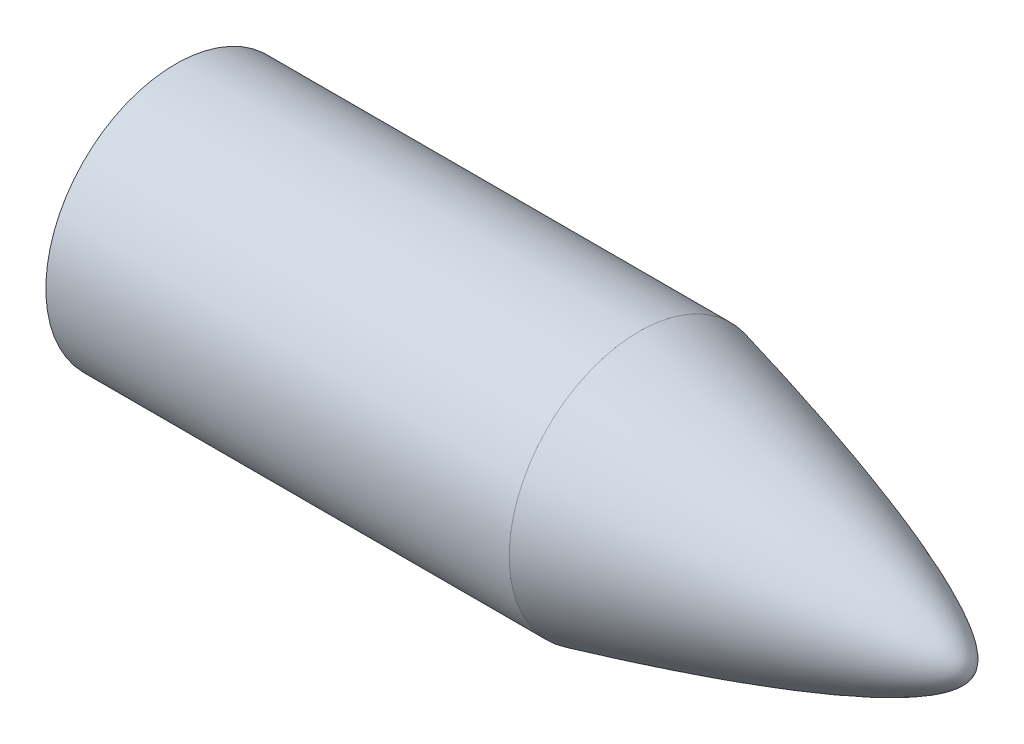
ISO-10303-21;
HEADER;
FILE_DESCRIPTION(('STEP AP214'),'2;1');
FILE_NAME('part.step','',(''),(''),'','','');
FILE_SCHEMA(('AUTOMOTIVE_DESIGN { 1 0 10303 214 1 1 1 1 }'));
ENDSEC;
DATA;
#1=APPLICATION_CONTEXT('core data for automotive mechanical design processes');
#2=APPLICATION_PROTOCOL_DEFINITION('international standard','automotive_design',2000,#1);
#3=PRODUCT_CONTEXT('',#1,'mechanical');
#4=PRODUCT('Part','Part','',(#3));
#5=PRODUCT_RELATED_PRODUCT_CATEGORY('part','',(#4));
#6=PRODUCT_DEFINITION_FORMATION('','',#4);
#7=PRODUCT_DEFINITION_CONTEXT('part definition',#1,'design');
#8=PRODUCT_DEFINITION('design','',#6,#7);
#9=PRODUCT_DEFINITION_SHAPE('','',#8);
#10=(LENGTH_UNIT() NAMED_UNIT(*) SI_UNIT(.MILLI.,.METRE.));
#11=(NAMED_UNIT(*) PLANE_ANGLE_UNIT() SI_UNIT($,.RADIAN.));
#12=(NAMED_UNIT(*) SI_UNIT($,.STERADIAN.) SOLID_ANGLE_UNIT());
#13=UNCERTAINTY_MEASURE_WITH_UNIT(LENGTH_MEASURE(1.E-05),#10,'distance_accuracy_value','');
#14=(GEOMETRIC_REPRESENTATION_CONTEXT(3) GLOBAL_UNCERTAINTY_ASSIGNED_CONTEXT((#13)) GLOBAL_UNIT_ASSIGNED_CONTEXT((#10,
#11,#12)) REPRESENTATION_CONTEXT('',''));
#15=CARTESIAN_POINT('',(0.,0.,0.));
#16=DIRECTION('',(0.,0.,1.));
#17=DIRECTION('',(1.,0.,0.));
#18=AXIS2_PLACEMENT_3D('',#15,#16,#17);
#19=CARTESIAN_POINT('',(-85.0440677966101,0.,-49.));
#20=DIRECTION('',(0.,-1.,0.));
#21=DIRECTION('',(0.986922201965997,0.,0.16119729298778));
#22=AXIS2_PLACEMENT_3D('',#19,#20,#21);
#23=ELLIPSE('',#22,303.9753279462,34.2803212372326);
#24=TRIMMED_CURVE('',#23,(PARAMETER_VALUE(1.20857444075924)),
(PARAMETER_VALUE(6.28318530717959)),.T.,.PARAMETER.);
#25=CARTESIAN_POINT('',(132.801477060158,0.,0.));
#26=DIRECTION('',(1.,0.,0.));
#27=AXIS1_PLACEMENT('',#25,#26);
#28=SURFACE_OF_REVOLUTION('',#24,#27);
#29=CARTESIAN_POINT('',(214.95593220339,0.,0.));
#30=VERTEX_POINT('',#29);
#31=VERTEX_LOOP('',#30);
#32=FACE_BOUND('',#31,.T.);
#33=CARTESIAN_POINT('',(89.9559322033898,0.,0.));
#34=DIRECTION('',(1.,0.,0.));
#35=DIRECTION('',(0.,0.,-1.));
#36=AXIS2_PLACEMENT_3D('',#33,#34,#35);
#37=CIRCLE('',#36,49.);
#38=CARTESIAN_POINT('',(89.9559322033898,0.,-49.));
#39=VERTEX_POINT('',#38);
#40=EDGE_CURVE('E11',#39,#39,#37,.T.);
#41=ORIENTED_EDGE('',*,*,#40,.T.);
#42=EDGE_LOOP('',(#41));
#43=FACE_BOUND('',#42,.T.);
#44=ADVANCED_FACE('F34',(#32,#43),#28,.T.);
#45=CARTESIAN_POINT('',(132.801477060158,0.,0.));
#46=DIRECTION('',(1.,0.,0.));
#47=DIRECTION('',(0.,0.,-1.));
#48=AXIS2_PLACEMENT_3D('',#45,#46,#47);
#49=CYLINDRICAL_SURFACE('',#48,49.);
#50=ORIENTED_EDGE('',*,*,#40,.F.);
#51=EDGE_LOOP('',(#50));
#52=FACE_BOUND('',#51,.T.);
#53=CARTESIAN_POINT('',(-85.0440677966101,0.,0.));
#54=DIRECTION('',(1.,0.,0.));
#55=DIRECTION('',(0.,0.,-1.));
#56=AXIS2_PLACEMENT_3D('',#53,#54,#55);
#57=CIRCLE('',#56,49.);
#58=CARTESIAN_POINT('',(-85.0440677966101,0.,-49.));
#59=VERTEX_POINT('',#58);
#60=EDGE_CURVE('E41',#59,#59,#57,.T.);
#61=ORIENTED_EDGE('',*,*,#60,.T.);
#62=EDGE_LOOP('',(#61));
#63=FACE_BOUND('',#62,.T.);
#64=ADVANCED_FACE('F46',(#52,#63),#49,.T.);
#65=CARTESIAN_POINT('',(-85.0440677966101,0.,0.));
#66=DIRECTION('',(-1.,0.,0.));
#67=DIRECTION('',(0.,0.,1.));
#68=AXIS2_PLACEMENT_3D('',#65,#66,#67);
#69=PLANE('',#68);
#70=ORIENTED_EDGE('',*,*,#60,.F.);
#71=EDGE_LOOP('',(#70));
#72=FACE_BOUND('',#71,.T.);
#73=ADVANCED_FACE('F51',(#72),#69,.T.);
#74=CLOSED_SHELL('',(#44,#64,#73));
#75=MANIFOLD_SOLID_BREP('B2',#74);
#76=ADVANCED_BREP_SHAPE_REPRESENTATION('',(#18,#75),#14);
#77=SHAPE_DEFINITION_REPRESENTATION(#9,#76);
ENDSEC;
END-ISO-10303-21;
